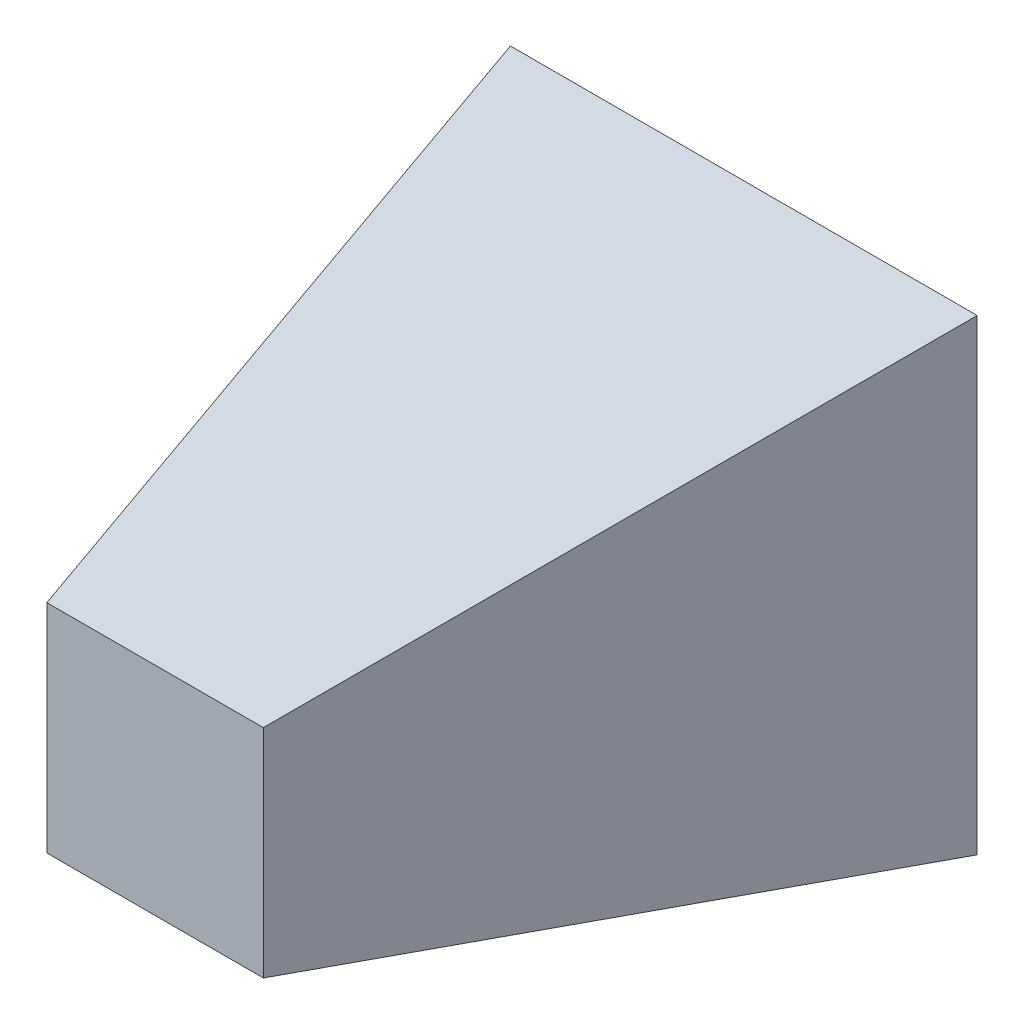
ISO-10303-21;
HEADER;
FILE_DESCRIPTION(('STEP AP214'),'2;1');
FILE_NAME('part.step','',(''),(''),'','','');
FILE_SCHEMA(('AUTOMOTIVE_DESIGN { 1 0 10303 214 1 1 1 1 }'));
ENDSEC;
DATA;
#1=APPLICATION_CONTEXT('core data for automotive mechanical design processes');
#2=APPLICATION_PROTOCOL_DEFINITION('international standard','automotive_design',2000,#1);
#3=PRODUCT_CONTEXT('',#1,'mechanical');
#4=PRODUCT('Part','Part','',(#3));
#5=PRODUCT_RELATED_PRODUCT_CATEGORY('part','',(#4));
#6=PRODUCT_DEFINITION_FORMATION('','',#4);
#7=PRODUCT_DEFINITION_CONTEXT('part definition',#1,'design');
#8=PRODUCT_DEFINITION('design','',#6,#7);
#9=PRODUCT_DEFINITION_SHAPE('','',#8);
#10=(LENGTH_UNIT() NAMED_UNIT(*) SI_UNIT(.MILLI.,.METRE.));
#11=(NAMED_UNIT(*) PLANE_ANGLE_UNIT() SI_UNIT($,.RADIAN.));
#12=(NAMED_UNIT(*) SI_UNIT($,.STERADIAN.) SOLID_ANGLE_UNIT());
#13=UNCERTAINTY_MEASURE_WITH_UNIT(LENGTH_MEASURE(1.E-05),#10,'distance_accuracy_value','');
#14=(GEOMETRIC_REPRESENTATION_CONTEXT(3) GLOBAL_UNCERTAINTY_ASSIGNED_CONTEXT((#13)) GLOBAL_UNIT_ASSIGNED_CONTEXT((#10,
#11,#12)) REPRESENTATION_CONTEXT('',''));
#15=CARTESIAN_POINT('',(0.,0.,0.));
#16=DIRECTION('',(0.,0.,1.));
#17=DIRECTION('',(1.,0.,0.));
#18=AXIS2_PLACEMENT_3D('',#15,#16,#17);
#19=CARTESIAN_POINT('',(-9.243,-1.7825,-21.));
#20=DIRECTION('',(-0.978147600733806,0.,0.207911690817759));
#21=DIRECTION('',(0.207911690817759,0.,0.978147600733806));
#22=AXIS2_PLACEMENT_3D('',#19,#20,#21);
#23=PLANE('',#22);
#24=DIRECTION('',(0.,-1.,0.));
#25=VECTOR('',#24,1.);
#26=CARTESIAN_POINT('',(-9.243,-1.7825,-21.));
#27=LINE('',#26,#25);
#28=CARTESIAN_POINT('',(-9.243,-1.7825,-21.));
#29=VERTEX_POINT('',#28);
#30=CARTESIAN_POINT('',(-9.243,-2.41722769963204,-21.));
#31=VERTEX_POINT('',#30);
#32=EDGE_CURVE('E11',#29,#31,#27,.T.);
#33=ORIENTED_EDGE('',*,*,#32,.T.);
#34=DIRECTION('',(-0.203558594952779,-0.203558594952779,-0.957667894857973));
#35=VECTOR('',#34,1.);
#36=CARTESIAN_POINT('',(-9.243,-2.41722769963204,-21.));
#37=LINE('',#36,#35);
#38=CARTESIAN_POINT('',(-9.07295475066398,-2.24718245029602,-20.2));
#39=VERTEX_POINT('',#38);
#40=EDGE_CURVE('E24',#39,#31,#37,.T.);
#41=ORIENTED_EDGE('',*,*,#40,.F.);
#42=DIRECTION('',(0.,-1.,0.));
#43=VECTOR('',#42,1.);
#44=CARTESIAN_POINT('',(-9.07295475066398,-1.7825,-20.2));
#45=LINE('',#44,#43);
#46=CARTESIAN_POINT('',(-9.07295475066398,-1.95254524933602,-20.2));
#47=VERTEX_POINT('',#46);
#48=EDGE_CURVE('E88',#47,#39,#45,.T.);
#49=ORIENTED_EDGE('',*,*,#48,.F.);
#50=DIRECTION('',(-0.203558594952779,0.203558594952779,-0.957667894857973));
#51=VECTOR('',#50,1.);
#52=CARTESIAN_POINT('',(-9.243,-1.7825,-21.));
#53=LINE('',#52,#51);
#54=EDGE_CURVE('E77',#47,#29,#53,.T.);
#55=ORIENTED_EDGE('',*,*,#54,.T.);
#56=EDGE_LOOP('',(#33,#41,#49,#55));
#57=FACE_BOUND('',#56,.T.);
#58=ADVANCED_FACE('F17',(#57),#23,.T.);
#59=CARTESIAN_POINT('',(-9.243,-2.41722769963204,-21.));
#60=DIRECTION('',(0.,-0.978147600733806,0.207911690817759));
#61=DIRECTION('',(0.,-0.207911690817759,-0.978147600733806));
#62=AXIS2_PLACEMENT_3D('',#59,#60,#61);
#63=PLANE('',#62);
#64=DIRECTION('',(1.,0.,0.));
#65=VECTOR('',#64,1.);
#66=CARTESIAN_POINT('',(-9.243,-2.41722769963204,-21.));
#67=LINE('',#66,#65);
#68=CARTESIAN_POINT('',(-8.60862434545006,-2.41722769963204,-21.));
#69=VERTEX_POINT('',#68);
#70=EDGE_CURVE('E85',#31,#69,#67,.T.);
#71=ORIENTED_EDGE('',*,*,#70,.T.);
#72=DIRECTION('',(0.203558594952779,-0.203558594952779,-0.957667894857973));
#73=VECTOR('',#72,1.);
#74=CARTESIAN_POINT('',(-8.63492498688711,-2.39092705819499,-20.8762652103966));
#75=LINE('',#74,#73);
#76=CARTESIAN_POINT('',(-8.77866959478607,-2.24718245029602,-20.2));
#77=VERTEX_POINT('',#76);
#78=EDGE_CURVE('E83',#77,#69,#75,.T.);
#79=ORIENTED_EDGE('',*,*,#78,.F.);
#80=DIRECTION('',(1.,0.,0.));
#81=VECTOR('',#80,1.);
#82=CARTESIAN_POINT('',(-9.243,-2.24718245029602,-20.2));
#83=LINE('',#82,#81);
#84=EDGE_CURVE('E72',#39,#77,#83,.T.);
#85=ORIENTED_EDGE('',*,*,#84,.F.);
#86=ORIENTED_EDGE('',*,*,#40,.T.);
#87=EDGE_LOOP('',(#71,#79,#85,#86));
#88=FACE_BOUND('',#87,.T.);
#89=ADVANCED_FACE('F90',(#88),#63,.T.);
#90=CARTESIAN_POINT('',(-8.60862434545006,-1.7825,-21.));
#91=DIRECTION('',(0.978147600733806,0.,0.207911690817759));
#92=DIRECTION('',(0.207911690817759,0.,-0.978147600733806));
#93=AXIS2_PLACEMENT_3D('',#90,#91,#92);
#94=PLANE('',#93);
#95=DIRECTION('',(0.,1.,0.));
#96=VECTOR('',#95,1.);
#97=CARTESIAN_POINT('',(-8.60862434545006,-1.7825,-21.));
#98=LINE('',#97,#96);
#99=CARTESIAN_POINT('',(-8.60862434545006,-1.7825,-21.));
#100=VERTEX_POINT('',#99);
#101=EDGE_CURVE('E60',#69,#100,#98,.T.);
#102=ORIENTED_EDGE('',*,*,#101,.T.);
#103=DIRECTION('',(0.203558594952779,0.203558594952779,-0.957667894857973));
#104=VECTOR('',#103,1.);
#105=CARTESIAN_POINT('',(-8.63491039951133,-1.80878605406127,-20.876333838604));
#106=LINE('',#105,#104);
#107=CARTESIAN_POINT('',(-8.77866959478607,-1.95254524933602,-20.2));
#108=VERTEX_POINT('',#107);
#109=EDGE_CURVE('E54',#108,#100,#106,.T.);
#110=ORIENTED_EDGE('',*,*,#109,.F.);
#111=DIRECTION('',(0.,1.,0.));
#112=VECTOR('',#111,1.);
#113=CARTESIAN_POINT('',(-8.77866959478607,-1.7825,-20.2));
#114=LINE('',#113,#112);
#115=EDGE_CURVE('E58',#77,#108,#114,.T.);
#116=ORIENTED_EDGE('',*,*,#115,.F.);
#117=ORIENTED_EDGE('',*,*,#78,.T.);
#118=EDGE_LOOP('',(#102,#110,#116,#117));
#119=FACE_BOUND('',#118,.T.);
#120=ADVANCED_FACE('F56',(#119),#94,.T.);
#121=CARTESIAN_POINT('',(-9.243,-1.7825,-21.));
#122=DIRECTION('',(0.,0.978147600733806,0.207911690817759));
#123=DIRECTION('',(0.,-0.207911690817759,0.978147600733806));
#124=AXIS2_PLACEMENT_3D('',#121,#122,#123);
#125=PLANE('',#124);
#126=DIRECTION('',(-1.,0.,0.));
#127=VECTOR('',#126,1.);
#128=CARTESIAN_POINT('',(-9.243,-1.7825,-21.));
#129=LINE('',#128,#127);
#130=EDGE_CURVE('E73',#100,#29,#129,.T.);
#131=ORIENTED_EDGE('',*,*,#130,.T.);
#132=ORIENTED_EDGE('',*,*,#54,.F.);
#133=DIRECTION('',(-1.,0.,0.));
#134=VECTOR('',#133,1.);
#135=CARTESIAN_POINT('',(-9.243,-1.95254524933602,-20.2));
#136=LINE('',#135,#134);
#137=EDGE_CURVE('E70',#108,#47,#136,.T.);
#138=ORIENTED_EDGE('',*,*,#137,.F.);
#139=ORIENTED_EDGE('',*,*,#109,.T.);
#140=EDGE_LOOP('',(#131,#132,#138,#139));
#141=FACE_BOUND('',#140,.T.);
#142=ADVANCED_FACE('F76',(#141),#125,.T.);
#143=CARTESIAN_POINT('',(0.,0.,-20.2));
#144=DIRECTION('',(0.,0.,1.));
#145=DIRECTION('',(1.,0.,0.));
#146=AXIS2_PLACEMENT_3D('',#143,#144,#145);
#147=PLANE('',#146);
#148=ORIENTED_EDGE('',*,*,#48,.T.);
#149=ORIENTED_EDGE('',*,*,#84,.T.);
#150=ORIENTED_EDGE('',*,*,#115,.T.);
#151=ORIENTED_EDGE('',*,*,#137,.T.);
#152=EDGE_LOOP('',(#148,#149,#150,#151));
#153=FACE_BOUND('',#152,.T.);
#154=ADVANCED_FACE('F69',(#153),#147,.T.);
#155=CARTESIAN_POINT('',(0.,0.,-21.));
#156=DIRECTION('',(0.,0.,1.));
#157=DIRECTION('',(1.,0.,0.));
#158=AXIS2_PLACEMENT_3D('',#155,#156,#157);
#159=PLANE('',#158);
#160=ORIENTED_EDGE('',*,*,#32,.F.);
#161=ORIENTED_EDGE('',*,*,#130,.F.);
#162=ORIENTED_EDGE('',*,*,#101,.F.);
#163=ORIENTED_EDGE('',*,*,#70,.F.);
#164=EDGE_LOOP('',(#160,#161,#162,#163));
#165=FACE_BOUND('',#164,.T.);
#166=ADVANCED_FACE('F91',(#165),#159,.F.);
#167=CLOSED_SHELL('',(#58,#89,#120,#142,#154,#166));
#168=MANIFOLD_SOLID_BREP('B1',#167);
#169=ADVANCED_BREP_SHAPE_REPRESENTATION('',(#18,#168),#14);
#170=SHAPE_DEFINITION_REPRESENTATION(#9,#169);
ENDSEC;
END-ISO-10303-21;
